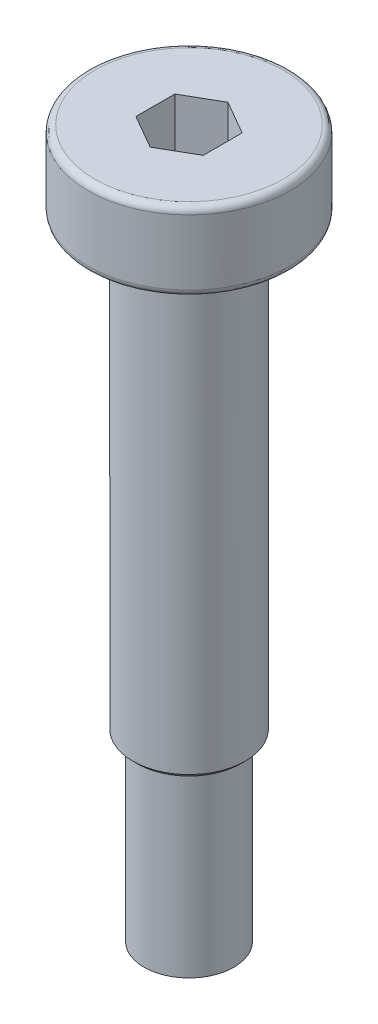
ISO-10303-21;
HEADER;
FILE_DESCRIPTION(('STEP AP214'),'2;1');
FILE_NAME('part.step','',(''),(''),'','','');
FILE_SCHEMA(('AUTOMOTIVE_DESIGN { 1 0 10303 214 1 1 1 1 }'));
ENDSEC;
DATA;
#1=APPLICATION_CONTEXT('core data for automotive mechanical design processes');
#2=APPLICATION_PROTOCOL_DEFINITION('international standard','automotive_design',2000,#1);
#3=PRODUCT_CONTEXT('',#1,'mechanical');
#4=PRODUCT('Part','Part','',(#3));
#5=PRODUCT_RELATED_PRODUCT_CATEGORY('part','',(#4));
#6=PRODUCT_DEFINITION_FORMATION('','',#4);
#7=PRODUCT_DEFINITION_CONTEXT('part definition',#1,'design');
#8=PRODUCT_DEFINITION('design','',#6,#7);
#9=PRODUCT_DEFINITION_SHAPE('','',#8);
#10=(LENGTH_UNIT() NAMED_UNIT(*) SI_UNIT(.MILLI.,.METRE.));
#11=(NAMED_UNIT(*) PLANE_ANGLE_UNIT() SI_UNIT($,.RADIAN.));
#12=(NAMED_UNIT(*) SI_UNIT($,.STERADIAN.) SOLID_ANGLE_UNIT());
#13=UNCERTAINTY_MEASURE_WITH_UNIT(LENGTH_MEASURE(1.E-05),#10,'distance_accuracy_value','');
#14=(GEOMETRIC_REPRESENTATION_CONTEXT(3) GLOBAL_UNCERTAINTY_ASSIGNED_CONTEXT((#13)) GLOBAL_UNIT_ASSIGNED_CONTEXT((#10,
#11,#12)) REPRESENTATION_CONTEXT('',''));
#15=CARTESIAN_POINT('',(0.,0.,0.));
#16=DIRECTION('',(0.,0.,1.));
#17=DIRECTION('',(1.,0.,0.));
#18=AXIS2_PLACEMENT_3D('',#15,#16,#17);
#19=CARTESIAN_POINT('',(0.,9.61644491026167,0.));
#20=DIRECTION('',(0.,1.,0.));
#21=DIRECTION('',(0.,0.,1.));
#22=AXIS2_PLACEMENT_3D('',#19,#20,#21);
#23=PLANE('',#22);
#24=DIRECTION('',(0.,0.,-1.));
#25=VECTOR('',#24,1.);
#26=CARTESIAN_POINT('',(1.5,9.61644491026167,0.86602540378444));
#27=LINE('',#26,#25);
#28=CARTESIAN_POINT('',(1.5,9.61644491026167,0.86602540378444));
#29=VERTEX_POINT('',#28);
#30=CARTESIAN_POINT('',(1.5,9.61644491026167,-0.866025403784439));
#31=VERTEX_POINT('',#30);
#32=EDGE_CURVE('E61',#29,#31,#27,.T.);
#33=ORIENTED_EDGE('',*,*,#32,.F.);
#34=DIRECTION('',(0.866025403784439,0.,-0.5));
#35=VECTOR('',#34,1.);
#36=CARTESIAN_POINT('',(0.,9.61644491026167,1.73205080756888));
#37=LINE('',#36,#35);
#38=CARTESIAN_POINT('',(0.,9.61644491026167,1.73205080756888));
#39=VERTEX_POINT('',#38);
#40=EDGE_CURVE('E154',#39,#29,#37,.T.);
#41=ORIENTED_EDGE('',*,*,#40,.F.);
#42=DIRECTION('',(0.866025403784438,0.,0.5));
#43=VECTOR('',#42,1.);
#44=CARTESIAN_POINT('',(-1.5,9.61644491026167,0.866025403784438));
#45=LINE('',#44,#43);
#46=CARTESIAN_POINT('',(-1.5,9.61644491026167,0.866025403784438));
#47=VERTEX_POINT('',#46);
#48=EDGE_CURVE('E151',#47,#39,#45,.T.);
#49=ORIENTED_EDGE('',*,*,#48,.F.);
#50=DIRECTION('',(0.,0.,1.));
#51=VECTOR('',#50,1.);
#52=CARTESIAN_POINT('',(-1.5,9.61644491026167,-0.866025403784439));
#53=LINE('',#52,#51);
#54=CARTESIAN_POINT('',(-1.5,9.61644491026167,-0.866025403784439));
#55=VERTEX_POINT('',#54);
#56=EDGE_CURVE('E109',#55,#47,#53,.T.);
#57=ORIENTED_EDGE('',*,*,#56,.F.);
#58=DIRECTION('',(-0.866025403784439,0.,0.5));
#59=VECTOR('',#58,1.);
#60=CARTESIAN_POINT('',(0.,9.61644491026167,-1.73205080756888));
#61=LINE('',#60,#59);
#62=CARTESIAN_POINT('',(0.,9.61644491026167,-1.73205080756888));
#63=VERTEX_POINT('',#62);
#64=EDGE_CURVE('E145',#63,#55,#61,.T.);
#65=ORIENTED_EDGE('',*,*,#64,.F.);
#66=DIRECTION('',(-0.866025403784439,0.,-0.5));
#67=VECTOR('',#66,1.);
#68=CARTESIAN_POINT('',(1.5,9.61644491026167,-0.866025403784438));
#69=LINE('',#68,#67);
#70=EDGE_CURVE('E141',#31,#63,#69,.T.);
#71=ORIENTED_EDGE('',*,*,#70,.F.);
#72=EDGE_LOOP('',(#33,#41,#49,#57,#65,#71));
#73=FACE_BOUND('',#72,.T.);
#74=CARTESIAN_POINT('',(0.,9.61644491026167,0.));
#75=DIRECTION('',(0.,1.,0.));
#76=DIRECTION('',(0.,0.,1.));
#77=AXIS2_PLACEMENT_3D('',#74,#75,#76);
#78=CIRCLE('',#77,4.2);
#79=CARTESIAN_POINT('',(0.,9.61644491026167,4.2));
#80=VERTEX_POINT('',#79);
#81=EDGE_CURVE('E193',#80,#80,#78,.T.);
#82=ORIENTED_EDGE('',*,*,#81,.T.);
#83=EDGE_LOOP('',(#82));
#84=FACE_BOUND('',#83,.T.);
#85=ADVANCED_FACE('F44',(#73,#84),#23,.T.);
#86=CARTESIAN_POINT('',(0.,13.2929154984969,0.));
#87=DIRECTION('',(0.,1.,0.));
#88=DIRECTION('',(0.,0.,1.));
#89=AXIS2_PLACEMENT_3D('',#86,#87,#88);
#90=CYLINDRICAL_SURFACE('',#89,4.5);
#91=CARTESIAN_POINT('',(0.,6.41644491026167,0.));
#92=DIRECTION('',(0.,-1.,0.));
#93=DIRECTION('',(0.,0.,-1.));
#94=AXIS2_PLACEMENT_3D('',#91,#92,#93);
#95=CIRCLE('',#94,4.5);
#96=CARTESIAN_POINT('',(0.,6.41644491026167,-4.5));
#97=VERTEX_POINT('',#96);
#98=EDGE_CURVE('E185',#97,#97,#95,.F.);
#99=ORIENTED_EDGE('',*,*,#98,.T.);
#100=EDGE_LOOP('',(#99));
#101=FACE_BOUND('',#100,.T.);
#102=CARTESIAN_POINT('',(0.,9.31644491026167,0.));
#103=DIRECTION('',(0.,1.,0.));
#104=DIRECTION('',(0.,0.,1.));
#105=AXIS2_PLACEMENT_3D('',#102,#103,#104);
#106=CIRCLE('',#105,4.5);
#107=CARTESIAN_POINT('',(0.,9.31644491026167,4.5));
#108=VERTEX_POINT('',#107);
#109=EDGE_CURVE('E181',#108,#108,#106,.F.);
#110=ORIENTED_EDGE('',*,*,#109,.T.);
#111=EDGE_LOOP('',(#110));
#112=FACE_BOUND('',#111,.T.);
#113=ADVANCED_FACE('F212',(#101,#112),#90,.T.);
#114=CARTESIAN_POINT('',(-4.5,6.11644491026167,0.));
#115=DIRECTION('',(0.,-1.,0.));
#116=DIRECTION('',(0.,0.,-1.));
#117=AXIS2_PLACEMENT_3D('',#114,#115,#116);
#118=PLANE('',#117);
#119=CARTESIAN_POINT('',(0.,6.11644491026167,0.));
#120=DIRECTION('',(0.,-1.,0.));
#121=DIRECTION('',(0.,0.,-1.));
#122=AXIS2_PLACEMENT_3D('',#119,#120,#121);
#123=CIRCLE('',#122,4.2);
#124=CARTESIAN_POINT('',(0.,6.11644491026167,-4.2));
#125=VERTEX_POINT('',#124);
#126=EDGE_CURVE('E189',#125,#125,#123,.T.);
#127=ORIENTED_EDGE('',*,*,#126,.T.);
#128=EDGE_LOOP('',(#127));
#129=FACE_BOUND('',#128,.T.);
#130=CARTESIAN_POINT('',(0.,6.11644491026167,0.));
#131=DIRECTION('',(0.,1.,0.));
#132=DIRECTION('',(0.,0.,1.));
#133=AXIS2_PLACEMENT_3D('',#130,#131,#132);
#134=CIRCLE('',#133,2.5);
#135=CARTESIAN_POINT('',(0.,6.11644491026167,2.5));
#136=VERTEX_POINT('',#135);
#137=EDGE_CURVE('E177',#136,#136,#134,.T.);
#138=ORIENTED_EDGE('',*,*,#137,.T.);
#139=EDGE_LOOP('',(#138));
#140=FACE_BOUND('',#139,.T.);
#141=ADVANCED_FACE('F218',(#129,#140),#118,.T.);
#142=CARTESIAN_POINT('',(0.,13.2929154984969,0.));
#143=DIRECTION('',(0.,1.,0.));
#144=DIRECTION('',(0.,0.,1.));
#145=AXIS2_PLACEMENT_3D('',#142,#143,#144);
#146=CYLINDRICAL_SURFACE('',#145,2.5);
#147=CARTESIAN_POINT('',(0.,-13.6835550897383,0.));
#148=DIRECTION('',(0.,-1.,0.));
#149=DIRECTION('',(0.,0.,-1.));
#150=AXIS2_PLACEMENT_3D('',#147,#148,#149);
#151=CIRCLE('',#150,2.5);
#152=CARTESIAN_POINT('',(0.,-13.6835550897383,-2.5));
#153=VERTEX_POINT('',#152);
#154=EDGE_CURVE('E54',#153,#153,#151,.F.);
#155=ORIENTED_EDGE('',*,*,#154,.T.);
#156=EDGE_LOOP('',(#155));
#157=FACE_BOUND('',#156,.T.);
#158=ORIENTED_EDGE('',*,*,#137,.F.);
#159=EDGE_LOOP('',(#158));
#160=FACE_BOUND('',#159,.T.);
#161=ADVANCED_FACE('F200',(#157,#160),#146,.T.);
#162=CARTESIAN_POINT('',(-2.5,-13.8835550897383,0.));
#163=DIRECTION('',(0.,-1.,0.));
#164=DIRECTION('',(0.,0.,-1.));
#165=AXIS2_PLACEMENT_3D('',#162,#163,#164);
#166=PLANE('',#165);
#167=CARTESIAN_POINT('',(0.,-13.8835550897383,0.));
#168=DIRECTION('',(0.,-1.,0.));
#169=DIRECTION('',(0.,0.,-1.));
#170=AXIS2_PLACEMENT_3D('',#167,#168,#169);
#171=CIRCLE('',#170,2.3);
#172=CARTESIAN_POINT('',(0.,-13.8835550897383,-2.3));
#173=VERTEX_POINT('',#172);
#174=EDGE_CURVE('E11',#173,#173,#171,.T.);
#175=ORIENTED_EDGE('',*,*,#174,.T.);
#176=EDGE_LOOP('',(#175));
#177=FACE_BOUND('',#176,.T.);
#178=CARTESIAN_POINT('',(0.,-13.8835550897383,0.));
#179=DIRECTION('',(0.,1.,0.));
#180=DIRECTION('',(0.,0.,1.));
#181=AXIS2_PLACEMENT_3D('',#178,#179,#180);
#182=CIRCLE('',#181,2.);
#183=CARTESIAN_POINT('',(0.,-13.8835550897383,2.));
#184=VERTEX_POINT('',#183);
#185=EDGE_CURVE('E173',#184,#184,#182,.T.);
#186=ORIENTED_EDGE('',*,*,#185,.T.);
#187=EDGE_LOOP('',(#186));
#188=FACE_BOUND('',#187,.T.);
#189=ADVANCED_FACE('F254',(#177,#188),#166,.T.);
#190=CARTESIAN_POINT('',(0.,13.2929154984969,0.));
#191=DIRECTION('',(0.,1.,0.));
#192=DIRECTION('',(0.,0.,1.));
#193=AXIS2_PLACEMENT_3D('',#190,#191,#192);
#194=CYLINDRICAL_SURFACE('',#193,2.);
#195=CARTESIAN_POINT('',(0.,-21.8835550897383,0.));
#196=DIRECTION('',(0.,1.,0.));
#197=DIRECTION('',(0.,0.,1.));
#198=AXIS2_PLACEMENT_3D('',#195,#196,#197);
#199=CIRCLE('',#198,2.);
#200=CARTESIAN_POINT('',(0.,-21.8835550897383,2.));
#201=VERTEX_POINT('',#200);
#202=EDGE_CURVE('E160',#201,#201,#199,.T.);
#203=ORIENTED_EDGE('',*,*,#202,.T.);
#204=EDGE_LOOP('',(#203));
#205=FACE_BOUND('',#204,.T.);
#206=ORIENTED_EDGE('',*,*,#185,.F.);
#207=EDGE_LOOP('',(#206));
#208=FACE_BOUND('',#207,.T.);
#209=ADVANCED_FACE('F250',(#205,#208),#194,.T.);
#210=CARTESIAN_POINT('',(-2.,-21.8835550897383,0.));
#211=DIRECTION('',(0.,-1.,0.));
#212=DIRECTION('',(0.,0.,-1.));
#213=AXIS2_PLACEMENT_3D('',#210,#211,#212);
#214=PLANE('',#213);
#215=ORIENTED_EDGE('',*,*,#202,.F.);
#216=EDGE_LOOP('',(#215));
#217=FACE_BOUND('',#216,.T.);
#218=ADVANCED_FACE('F227',(#217),#214,.T.);
#219=CARTESIAN_POINT('',(0.,6.41644491026167,0.));
#220=DIRECTION('',(0.,-1.,0.));
#221=DIRECTION('',(0.,0.,-1.));
#222=AXIS2_PLACEMENT_3D('',#219,#220,#221);
#223=TOROIDAL_SURFACE('',#222,4.2,0.3);
#224=ORIENTED_EDGE('',*,*,#126,.F.);
#225=EDGE_LOOP('',(#224));
#226=FACE_BOUND('',#225,.T.);
#227=ORIENTED_EDGE('',*,*,#98,.F.);
#228=EDGE_LOOP('',(#227));
#229=FACE_BOUND('',#228,.T.);
#230=ADVANCED_FACE('F224',(#226,#229),#223,.T.);
#231=CARTESIAN_POINT('',(0.,9.31644491026167,0.));
#232=DIRECTION('',(0.,1.,0.));
#233=DIRECTION('',(0.,0.,1.));
#234=AXIS2_PLACEMENT_3D('',#231,#232,#233);
#235=TOROIDAL_SURFACE('',#234,4.2,0.3);
#236=ORIENTED_EDGE('',*,*,#109,.F.);
#237=EDGE_LOOP('',(#236));
#238=FACE_BOUND('',#237,.T.);
#239=ORIENTED_EDGE('',*,*,#81,.F.);
#240=EDGE_LOOP('',(#239));
#241=FACE_BOUND('',#240,.T.);
#242=ADVANCED_FACE('F226',(#238,#241),#235,.T.);
#243=CARTESIAN_POINT('',(1.5,7.21644491026167,0.86602540378444));
#244=DIRECTION('',(1.,0.,0.));
#245=DIRECTION('',(0.,0.,-1.));
#246=AXIS2_PLACEMENT_3D('',#243,#244,#245);
#247=PLANE('',#246);
#248=ORIENTED_EDGE('',*,*,#32,.T.);
#249=DIRECTION('',(0.,1.,0.));
#250=VECTOR('',#249,1.);
#251=CARTESIAN_POINT('',(1.5,7.21644491026167,-0.866025403784438));
#252=LINE('',#251,#250);
#253=CARTESIAN_POINT('',(1.5,7.21644491026167,-0.866025403784438));
#254=VERTEX_POINT('',#253);
#255=EDGE_CURVE('E91',#254,#31,#252,.T.);
#256=ORIENTED_EDGE('',*,*,#255,.F.);
#257=DIRECTION('',(0.,0.,-1.));
#258=VECTOR('',#257,1.);
#259=CARTESIAN_POINT('',(1.5,7.21644491026167,0.86602540378444));
#260=LINE('',#259,#258);
#261=CARTESIAN_POINT('',(1.5,7.21644491026167,0.86602540378444));
#262=VERTEX_POINT('',#261);
#263=EDGE_CURVE('E157',#262,#254,#260,.T.);
#264=ORIENTED_EDGE('',*,*,#263,.F.);
#265=DIRECTION('',(0.,1.,0.));
#266=VECTOR('',#265,1.);
#267=CARTESIAN_POINT('',(1.5,7.21644491026167,0.86602540378444));
#268=LINE('',#267,#266);
#269=EDGE_CURVE('E69',#262,#29,#268,.T.);
#270=ORIENTED_EDGE('',*,*,#269,.T.);
#271=EDGE_LOOP('',(#248,#256,#264,#270));
#272=FACE_BOUND('',#271,.T.);
#273=ADVANCED_FACE('F230',(#272),#247,.F.);
#274=CARTESIAN_POINT('',(0.,7.21644491026167,1.73205080756888));
#275=DIRECTION('',(0.5,0.,0.866025403784439));
#276=DIRECTION('',(0.866025403784439,0.,-0.5));
#277=AXIS2_PLACEMENT_3D('',#274,#275,#276);
#278=PLANE('',#277);
#279=ORIENTED_EDGE('',*,*,#40,.T.);
#280=ORIENTED_EDGE('',*,*,#269,.F.);
#281=DIRECTION('',(0.866025403784439,0.,-0.5));
#282=VECTOR('',#281,1.);
#283=CARTESIAN_POINT('',(0.,7.21644491026167,1.73205080756888));
#284=LINE('',#283,#282);
#285=CARTESIAN_POINT('',(0.,7.21644491026167,1.73205080756888));
#286=VERTEX_POINT('',#285);
#287=EDGE_CURVE('E123',#286,#262,#284,.T.);
#288=ORIENTED_EDGE('',*,*,#287,.F.);
#289=DIRECTION('',(0.,1.,0.));
#290=VECTOR('',#289,1.);
#291=CARTESIAN_POINT('',(0.,7.21644491026167,1.73205080756888));
#292=LINE('',#291,#290);
#293=EDGE_CURVE('E114',#286,#39,#292,.T.);
#294=ORIENTED_EDGE('',*,*,#293,.T.);
#295=EDGE_LOOP('',(#279,#280,#288,#294));
#296=FACE_BOUND('',#295,.T.);
#297=ADVANCED_FACE('F235',(#296),#278,.F.);
#298=CARTESIAN_POINT('',(-1.5,7.21644491026167,0.866025403784438));
#299=DIRECTION('',(-0.5,0.,0.866025403784439));
#300=DIRECTION('',(0.866025403784439,0.,0.5));
#301=AXIS2_PLACEMENT_3D('',#298,#299,#300);
#302=PLANE('',#301);
#303=ORIENTED_EDGE('',*,*,#48,.T.);
#304=ORIENTED_EDGE('',*,*,#293,.F.);
#305=DIRECTION('',(0.866025403784438,0.,0.5));
#306=VECTOR('',#305,1.);
#307=CARTESIAN_POINT('',(-1.5,7.21644491026167,0.866025403784438));
#308=LINE('',#307,#306);
#309=CARTESIAN_POINT('',(-1.5,7.21644491026167,0.866025403784438));
#310=VERTEX_POINT('',#309);
#311=EDGE_CURVE('E118',#310,#286,#308,.T.);
#312=ORIENTED_EDGE('',*,*,#311,.F.);
#313=DIRECTION('',(0.,1.,0.));
#314=VECTOR('',#313,1.);
#315=CARTESIAN_POINT('',(-1.5,7.21644491026167,0.866025403784438));
#316=LINE('',#315,#314);
#317=EDGE_CURVE('E102',#310,#47,#316,.T.);
#318=ORIENTED_EDGE('',*,*,#317,.T.);
#319=EDGE_LOOP('',(#303,#304,#312,#318));
#320=FACE_BOUND('',#319,.T.);
#321=ADVANCED_FACE('F119',(#320),#302,.F.);
#322=CARTESIAN_POINT('',(-1.5,7.21644491026167,-0.866025403784439));
#323=DIRECTION('',(-1.,0.,0.));
#324=DIRECTION('',(0.,0.,1.));
#325=AXIS2_PLACEMENT_3D('',#322,#323,#324);
#326=PLANE('',#325);
#327=ORIENTED_EDGE('',*,*,#56,.T.);
#328=ORIENTED_EDGE('',*,*,#317,.F.);
#329=DIRECTION('',(0.,0.,1.));
#330=VECTOR('',#329,1.);
#331=CARTESIAN_POINT('',(-1.5,7.21644491026167,-0.866025403784439));
#332=LINE('',#331,#330);
#333=CARTESIAN_POINT('',(-1.5,7.21644491026167,-0.866025403784439));
#334=VERTEX_POINT('',#333);
#335=EDGE_CURVE('E106',#334,#310,#332,.T.);
#336=ORIENTED_EDGE('',*,*,#335,.F.);
#337=DIRECTION('',(0.,1.,0.));
#338=VECTOR('',#337,1.);
#339=CARTESIAN_POINT('',(-1.5,7.21644491026167,-0.866025403784439));
#340=LINE('',#339,#338);
#341=EDGE_CURVE('E115',#334,#55,#340,.T.);
#342=ORIENTED_EDGE('',*,*,#341,.T.);
#343=EDGE_LOOP('',(#327,#328,#336,#342));
#344=FACE_BOUND('',#343,.T.);
#345=ADVANCED_FACE('F104',(#344),#326,.F.);
#346=CARTESIAN_POINT('',(0.,7.21644491026167,-1.73205080756888));
#347=DIRECTION('',(-0.5,0.,-0.866025403784439));
#348=DIRECTION('',(-0.866025403784439,0.,0.5));
#349=AXIS2_PLACEMENT_3D('',#346,#347,#348);
#350=PLANE('',#349);
#351=ORIENTED_EDGE('',*,*,#64,.T.);
#352=ORIENTED_EDGE('',*,*,#341,.F.);
#353=DIRECTION('',(-0.866025403784439,0.,0.5));
#354=VECTOR('',#353,1.);
#355=CARTESIAN_POINT('',(0.,7.21644491026167,-1.73205080756888));
#356=LINE('',#355,#354);
#357=CARTESIAN_POINT('',(0.,7.21644491026167,-1.73205080756888));
#358=VERTEX_POINT('',#357);
#359=EDGE_CURVE('E129',#358,#334,#356,.T.);
#360=ORIENTED_EDGE('',*,*,#359,.F.);
#361=DIRECTION('',(0.,1.,0.));
#362=VECTOR('',#361,1.);
#363=CARTESIAN_POINT('',(0.,7.21644491026167,-1.73205080756888));
#364=LINE('',#363,#362);
#365=EDGE_CURVE('E165',#358,#63,#364,.T.);
#366=ORIENTED_EDGE('',*,*,#365,.T.);
#367=EDGE_LOOP('',(#351,#352,#360,#366));
#368=FACE_BOUND('',#367,.T.);
#369=ADVANCED_FACE('F330',(#368),#350,.F.);
#370=CARTESIAN_POINT('',(1.5,7.21644491026167,-0.866025403784438));
#371=DIRECTION('',(0.5,0.,-0.866025403784439));
#372=DIRECTION('',(-0.866025403784439,0.,-0.5));
#373=AXIS2_PLACEMENT_3D('',#370,#371,#372);
#374=PLANE('',#373);
#375=ORIENTED_EDGE('',*,*,#70,.T.);
#376=ORIENTED_EDGE('',*,*,#365,.F.);
#377=DIRECTION('',(-0.866025403784439,0.,-0.5));
#378=VECTOR('',#377,1.);
#379=CARTESIAN_POINT('',(1.5,7.21644491026167,-0.866025403784438));
#380=LINE('',#379,#378);
#381=EDGE_CURVE('E133',#254,#358,#380,.T.);
#382=ORIENTED_EDGE('',*,*,#381,.F.);
#383=ORIENTED_EDGE('',*,*,#255,.T.);
#384=EDGE_LOOP('',(#375,#376,#382,#383));
#385=FACE_BOUND('',#384,.T.);
#386=ADVANCED_FACE('F208',(#385),#374,.F.);
#387=CARTESIAN_POINT('',(0.,7.21644491026167,0.));
#388=DIRECTION('',(0.,1.,0.));
#389=DIRECTION('',(0.,0.,1.));
#390=AXIS2_PLACEMENT_3D('',#387,#388,#389);
#391=PLANE('',#390);
#392=ORIENTED_EDGE('',*,*,#263,.T.);
#393=ORIENTED_EDGE('',*,*,#381,.T.);
#394=ORIENTED_EDGE('',*,*,#359,.T.);
#395=ORIENTED_EDGE('',*,*,#335,.T.);
#396=ORIENTED_EDGE('',*,*,#311,.T.);
#397=ORIENTED_EDGE('',*,*,#287,.T.);
#398=EDGE_LOOP('',(#392,#393,#394,#395,#396,#397));
#399=FACE_BOUND('',#398,.T.);
#400=ADVANCED_FACE('F126',(#399),#391,.T.);
#401=CARTESIAN_POINT('',(0.,-13.6835550897383,0.));
#402=DIRECTION('',(0.,1.,0.));
#403=DIRECTION('',(0.,0.,1.));
#404=AXIS2_PLACEMENT_3D('',#401,#402,#403);
#405=CONICAL_SURFACE('',#404,2.5,0.785398163397456);
#406=ORIENTED_EDGE('',*,*,#174,.F.);
#407=EDGE_LOOP('',(#406));
#408=FACE_BOUND('',#407,.T.);
#409=ORIENTED_EDGE('',*,*,#154,.F.);
#410=EDGE_LOOP('',(#409));
#411=FACE_BOUND('',#410,.T.);
#412=ADVANCED_FACE('F47',(#408,#411),#405,.T.);
#413=CLOSED_SHELL('',(#85,#113,#141,#161,#189,#209,#218,#230,#242,#273,#297,#321,#345,#369,#386,
#400,#412));
#414=MANIFOLD_SOLID_BREP('B2',#413);
#415=ADVANCED_BREP_SHAPE_REPRESENTATION('',(#18,#414),#14);
#416=SHAPE_DEFINITION_REPRESENTATION(#9,#415);
ENDSEC;
END-ISO-10303-21;
